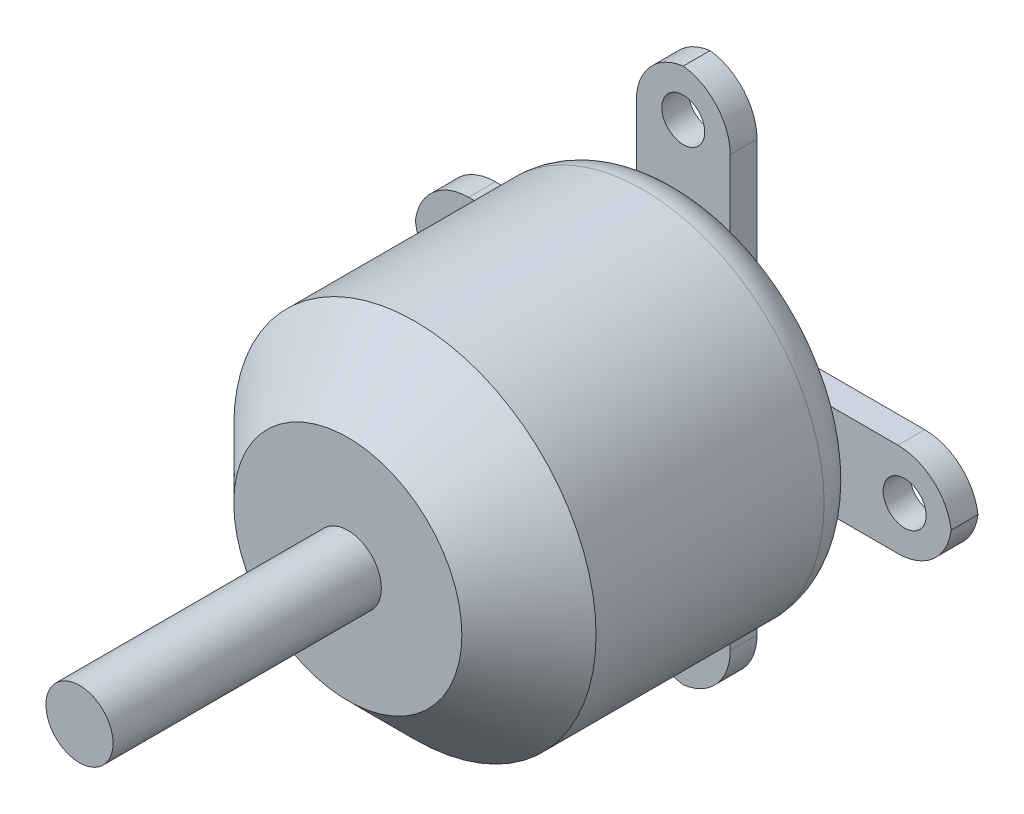
ISO-10303-21;
HEADER;
FILE_DESCRIPTION(('STEP AP214'),'2;1');
FILE_NAME('part.step','',(''),(''),'','','');
FILE_SCHEMA(('AUTOMOTIVE_DESIGN { 1 0 10303 214 1 1 1 1 }'));
ENDSEC;
DATA;
#1=APPLICATION_CONTEXT('core data for automotive mechanical design processes');
#2=APPLICATION_PROTOCOL_DEFINITION('international standard','automotive_design',2000,#1);
#3=PRODUCT_CONTEXT('',#1,'mechanical');
#4=PRODUCT('Part','Part','',(#3));
#5=PRODUCT_RELATED_PRODUCT_CATEGORY('part','',(#4));
#6=PRODUCT_DEFINITION_FORMATION('','',#4);
#7=PRODUCT_DEFINITION_CONTEXT('part definition',#1,'design');
#8=PRODUCT_DEFINITION('design','',#6,#7);
#9=PRODUCT_DEFINITION_SHAPE('','',#8);
#10=(LENGTH_UNIT() NAMED_UNIT(*) SI_UNIT(.MILLI.,.METRE.));
#11=(NAMED_UNIT(*) PLANE_ANGLE_UNIT() SI_UNIT($,.RADIAN.));
#12=(NAMED_UNIT(*) SI_UNIT($,.STERADIAN.) SOLID_ANGLE_UNIT());
#13=UNCERTAINTY_MEASURE_WITH_UNIT(LENGTH_MEASURE(1.E-05),#10,'distance_accuracy_value','');
#14=(GEOMETRIC_REPRESENTATION_CONTEXT(3) GLOBAL_UNCERTAINTY_ASSIGNED_CONTEXT((#13)) GLOBAL_UNIT_ASSIGNED_CONTEXT((#10,
#11,#12)) REPRESENTATION_CONTEXT('',''));
#15=CARTESIAN_POINT('',(0.,0.,0.));
#16=DIRECTION('',(0.,0.,1.));
#17=DIRECTION('',(1.,0.,0.));
#18=AXIS2_PLACEMENT_3D('',#15,#16,#17);
#19=CARTESIAN_POINT('',(0.,0.,0.));
#20=DIRECTION('',(0.,0.,1.));
#21=DIRECTION('',(1.,0.,0.));
#22=AXIS2_PLACEMENT_3D('',#19,#20,#21);
#23=PLANE('',#22);
#24=DIRECTION('',(0.,-1.,0.));
#25=VECTOR('',#24,1.);
#26=CARTESIAN_POINT('',(3.5,16.,0.));
#27=LINE('',#26,#25);
#28=CARTESIAN_POINT('',(3.5,9.89949493661167,0.));
#29=VERTEX_POINT('',#28);
#30=CARTESIAN_POINT('',(3.5,7.5,0.));
#31=VERTEX_POINT('',#30);
#32=EDGE_CURVE('E306',#29,#31,#27,.T.);
#33=ORIENTED_EDGE('',*,*,#32,.F.);
#34=CARTESIAN_POINT('',(0.,0.,0.));
#35=DIRECTION('',(0.,0.,1.));
#36=DIRECTION('',(1.,0.,0.));
#37=AXIS2_PLACEMENT_3D('',#34,#35,#36);
#38=CIRCLE('',#37,10.5);
#39=CARTESIAN_POINT('',(9.89949493661166,3.5,0.));
#40=VERTEX_POINT('',#39);
#41=EDGE_CURVE('E635',#29,#40,#38,.F.);
#42=ORIENTED_EDGE('',*,*,#41,.T.);
#43=DIRECTION('',(1.,0.,0.));
#44=VECTOR('',#43,1.);
#45=CARTESIAN_POINT('',(16.,3.5,0.));
#46=LINE('',#45,#44);
#47=CARTESIAN_POINT('',(7.5,3.5,0.));
#48=VERTEX_POINT('',#47);
#49=EDGE_CURVE('E55',#48,#40,#46,.T.);
#50=ORIENTED_EDGE('',*,*,#49,.F.);
#51=CARTESIAN_POINT('',(7.5,7.5,0.));
#52=DIRECTION('',(0.,0.,1.));
#53=DIRECTION('',(1.,0.,0.));
#54=AXIS2_PLACEMENT_3D('',#51,#52,#53);
#55=CIRCLE('',#54,4.);
#56=EDGE_CURVE('E50',#31,#48,#55,.T.);
#57=ORIENTED_EDGE('',*,*,#56,.F.);
#58=EDGE_LOOP('',(#33,#42,#50,#57));
#59=FACE_BOUND('',#58,.T.);
#60=ADVANCED_FACE('F34',(#59),#23,.F.);
#61=DIRECTION('',(-1.,0.,0.));
#62=VECTOR('',#61,1.);
#63=CARTESIAN_POINT('',(16.,-3.5,0.));
#64=LINE('',#63,#62);
#65=CARTESIAN_POINT('',(9.89949493661044,-3.5,0.));
#66=VERTEX_POINT('',#65);
#67=CARTESIAN_POINT('',(7.5,-3.5,0.));
#68=VERTEX_POINT('',#67);
#69=EDGE_CURVE('E320',#66,#68,#64,.T.);
#70=ORIENTED_EDGE('',*,*,#69,.F.);
#71=CARTESIAN_POINT('',(3.5,-9.89949493661166,0.));
#72=VERTEX_POINT('',#71);
#73=EDGE_CURVE('E241',#66,#72,#38,.F.);
#74=ORIENTED_EDGE('',*,*,#73,.T.);
#75=DIRECTION('',(0.,-1.,0.));
#76=VECTOR('',#75,1.);
#77=CARTESIAN_POINT('',(3.5,-7.5,0.));
#78=LINE('',#77,#76);
#79=CARTESIAN_POINT('',(3.5,-7.5,0.));
#80=VERTEX_POINT('',#79);
#81=EDGE_CURVE('E329',#80,#72,#78,.T.);
#82=ORIENTED_EDGE('',*,*,#81,.F.);
#83=CARTESIAN_POINT('',(7.5,-7.5,0.));
#84=DIRECTION('',(0.,0.,1.));
#85=DIRECTION('',(-1.,0.,0.));
#86=AXIS2_PLACEMENT_3D('',#83,#84,#85);
#87=CIRCLE('',#86,4.);
#88=EDGE_CURVE('E324',#68,#80,#87,.T.);
#89=ORIENTED_EDGE('',*,*,#88,.F.);
#90=EDGE_LOOP('',(#70,#74,#82,#89));
#91=FACE_BOUND('',#90,.T.);
#92=ADVANCED_FACE('F270',(#91),#23,.F.);
#93=DIRECTION('',(0.,1.,0.));
#94=VECTOR('',#93,1.);
#95=CARTESIAN_POINT('',(-3.5,-7.5,0.));
#96=LINE('',#95,#94);
#97=CARTESIAN_POINT('',(-3.5,-9.89949493661166,0.));
#98=VERTEX_POINT('',#97);
#99=CARTESIAN_POINT('',(-3.5,-7.5,0.));
#100=VERTEX_POINT('',#99);
#101=EDGE_CURVE('E338',#98,#100,#96,.T.);
#102=ORIENTED_EDGE('',*,*,#101,.F.);
#103=CARTESIAN_POINT('',(-9.89949493661167,-3.5,0.));
#104=VERTEX_POINT('',#103);
#105=EDGE_CURVE('E638',#98,#104,#38,.F.);
#106=ORIENTED_EDGE('',*,*,#105,.T.);
#107=DIRECTION('',(-1.,0.,0.));
#108=VECTOR('',#107,1.);
#109=CARTESIAN_POINT('',(-7.5,-3.5,0.));
#110=LINE('',#109,#108);
#111=CARTESIAN_POINT('',(-7.5,-3.5,0.));
#112=VERTEX_POINT('',#111);
#113=EDGE_CURVE('E347',#112,#104,#110,.T.);
#114=ORIENTED_EDGE('',*,*,#113,.F.);
#115=CARTESIAN_POINT('',(-7.5,-7.5,0.));
#116=DIRECTION('',(0.,0.,1.));
#117=DIRECTION('',(1.,0.,0.));
#118=AXIS2_PLACEMENT_3D('',#115,#116,#117);
#119=CIRCLE('',#118,4.);
#120=EDGE_CURVE('E343',#100,#112,#119,.T.);
#121=ORIENTED_EDGE('',*,*,#120,.F.);
#122=EDGE_LOOP('',(#102,#106,#114,#121));
#123=FACE_BOUND('',#122,.T.);
#124=ADVANCED_FACE('F276',(#123),#23,.F.);
#125=DIRECTION('',(0.,1.,0.));
#126=VECTOR('',#125,1.);
#127=CARTESIAN_POINT('',(-3.5,16.,0.));
#128=LINE('',#127,#126);
#129=CARTESIAN_POINT('',(-3.5,7.5,0.));
#130=VERTEX_POINT('',#129);
#131=CARTESIAN_POINT('',(-3.5,9.89949493661167,0.));
#132=VERTEX_POINT('',#131);
#133=EDGE_CURVE('E290',#130,#132,#128,.T.);
#134=ORIENTED_EDGE('',*,*,#133,.F.);
#135=CARTESIAN_POINT('',(-7.5,7.5,0.));
#136=DIRECTION('',(0.,0.,1.));
#137=DIRECTION('',(-1.,0.,0.));
#138=AXIS2_PLACEMENT_3D('',#135,#136,#137);
#139=CIRCLE('',#138,4.);
#140=CARTESIAN_POINT('',(-7.5,3.5,0.));
#141=VERTEX_POINT('',#140);
#142=EDGE_CURVE('E222',#141,#130,#139,.T.);
#143=ORIENTED_EDGE('',*,*,#142,.F.);
#144=DIRECTION('',(1.,0.,0.));
#145=VECTOR('',#144,1.);
#146=CARTESIAN_POINT('',(-7.5,3.5,0.));
#147=LINE('',#146,#145);
#148=CARTESIAN_POINT('',(-9.89949493661167,3.5,0.));
#149=VERTEX_POINT('',#148);
#150=EDGE_CURVE('E355',#149,#141,#147,.T.);
#151=ORIENTED_EDGE('',*,*,#150,.F.);
#152=EDGE_CURVE('E293',#149,#132,#38,.F.);
#153=ORIENTED_EDGE('',*,*,#152,.T.);
#154=EDGE_LOOP('',(#134,#143,#151,#153));
#155=FACE_BOUND('',#154,.T.);
#156=ADVANCED_FACE('F272',(#155),#23,.F.);
#157=CARTESIAN_POINT('',(0.,0.,25.));
#158=DIRECTION('',(0.,0.,-1.));
#159=DIRECTION('',(-1.,0.,0.));
#160=AXIS2_PLACEMENT_3D('',#157,#158,#159);
#161=CYLINDRICAL_SURFACE('',#160,13.5);
#162=CARTESIAN_POINT('',(0.,0.,20.));
#163=DIRECTION('',(0.,0.,1.));
#164=DIRECTION('',(1.,0.,0.));
#165=AXIS2_PLACEMENT_3D('',#162,#163,#164);
#166=CIRCLE('',#165,13.5);
#167=CARTESIAN_POINT('',(13.5,0.,20.));
#168=VERTEX_POINT('',#167);
#169=EDGE_CURVE('E11',#168,#168,#166,.F.);
#170=ORIENTED_EDGE('',*,*,#169,.T.);
#171=EDGE_LOOP('',(#170));
#172=FACE_BOUND('',#171,.T.);
#173=CARTESIAN_POINT('',(0.,0.,3.));
#174=DIRECTION('',(0.,0.,1.));
#175=DIRECTION('',(1.,0.,0.));
#176=AXIS2_PLACEMENT_3D('',#173,#174,#175);
#177=CIRCLE('',#176,13.5);
#178=CARTESIAN_POINT('',(13.5,0.,3.));
#179=VERTEX_POINT('',#178);
#180=EDGE_CURVE('E235',#179,#179,#177,.T.);
#181=ORIENTED_EDGE('',*,*,#180,.T.);
#182=EDGE_LOOP('',(#181));
#183=FACE_BOUND('',#182,.T.);
#184=ADVANCED_FACE('F281',(#172,#183),#161,.T.);
#185=CARTESIAN_POINT('',(0.,0.,25.));
#186=DIRECTION('',(0.,0.,1.));
#187=DIRECTION('',(1.,0.,0.));
#188=AXIS2_PLACEMENT_3D('',#185,#186,#187);
#189=PLANE('',#188);
#190=CARTESIAN_POINT('',(0.,0.,25.));
#191=DIRECTION('',(0.,0.,1.));
#192=DIRECTION('',(1.,0.,0.));
#193=AXIS2_PLACEMENT_3D('',#190,#191,#192);
#194=CIRCLE('',#193,8.49999999999999);
#195=CARTESIAN_POINT('',(8.49999999999999,0.,25.));
#196=VERTEX_POINT('',#195);
#197=EDGE_CURVE('E43',#196,#196,#194,.T.);
#198=ORIENTED_EDGE('',*,*,#197,.T.);
#199=EDGE_LOOP('',(#198));
#200=FACE_BOUND('',#199,.T.);
#201=CARTESIAN_POINT('',(0.,0.,25.));
#202=DIRECTION('',(0.,0.,1.));
#203=DIRECTION('',(1.,0.,0.));
#204=AXIS2_PLACEMENT_3D('',#201,#202,#203);
#205=CIRCLE('',#204,2.5);
#206=CARTESIAN_POINT('',(2.5,0.,25.));
#207=VERTEX_POINT('',#206);
#208=EDGE_CURVE('E223',#207,#207,#205,.T.);
#209=ORIENTED_EDGE('',*,*,#208,.F.);
#210=EDGE_LOOP('',(#209));
#211=FACE_BOUND('',#210,.T.);
#212=ADVANCED_FACE('F251',(#200,#211),#189,.T.);
#213=CARTESIAN_POINT('',(0.,0.,45.));
#214=DIRECTION('',(0.,0.,-1.));
#215=DIRECTION('',(-1.,0.,0.));
#216=AXIS2_PLACEMENT_3D('',#213,#214,#215);
#217=CYLINDRICAL_SURFACE('',#216,2.5);
#218=CARTESIAN_POINT('',(0.,0.,45.));
#219=DIRECTION('',(0.,0.,1.));
#220=DIRECTION('',(1.,0.,0.));
#221=AXIS2_PLACEMENT_3D('',#218,#219,#220);
#222=CIRCLE('',#221,2.5);
#223=CARTESIAN_POINT('',(2.5,0.,45.));
#224=VERTEX_POINT('',#223);
#225=EDGE_CURVE('E227',#224,#224,#222,.T.);
#226=ORIENTED_EDGE('',*,*,#225,.F.);
#227=EDGE_LOOP('',(#226));
#228=FACE_BOUND('',#227,.T.);
#229=ORIENTED_EDGE('',*,*,#208,.T.);
#230=EDGE_LOOP('',(#229));
#231=FACE_BOUND('',#230,.T.);
#232=ADVANCED_FACE('F549',(#228,#231),#217,.T.);
#233=CARTESIAN_POINT('',(0.,0.,45.));
#234=DIRECTION('',(0.,0.,1.));
#235=DIRECTION('',(1.,0.,0.));
#236=AXIS2_PLACEMENT_3D('',#233,#234,#235);
#237=PLANE('',#236);
#238=ORIENTED_EDGE('',*,*,#225,.T.);
#239=EDGE_LOOP('',(#238));
#240=FACE_BOUND('',#239,.T.);
#241=ADVANCED_FACE('F266',(#240),#237,.T.);
#242=CARTESIAN_POINT('',(0.,0.,3.));
#243=DIRECTION('',(0.,0.,1.));
#244=DIRECTION('',(1.,0.,0.));
#245=AXIS2_PLACEMENT_3D('',#242,#243,#244);
#246=TOROIDAL_SURFACE('',#245,10.5,3.);
#247=ORIENTED_EDGE('',*,*,#73,.F.);
#248=EDGE_CURVE('E240',#40,#66,#38,.F.);
#249=ORIENTED_EDGE('',*,*,#248,.F.);
#250=ORIENTED_EDGE('',*,*,#41,.F.);
#251=EDGE_CURVE('E426',#132,#29,#38,.F.);
#252=ORIENTED_EDGE('',*,*,#251,.F.);
#253=ORIENTED_EDGE('',*,*,#152,.F.);
#254=EDGE_CURVE('E636',#104,#149,#38,.F.);
#255=ORIENTED_EDGE('',*,*,#254,.F.);
#256=ORIENTED_EDGE('',*,*,#105,.F.);
#257=EDGE_CURVE('E243',#72,#98,#38,.F.);
#258=ORIENTED_EDGE('',*,*,#257,.F.);
#259=EDGE_LOOP('',(#247,#249,#250,#252,#253,#255,#256,#258));
#260=FACE_BOUND('',#259,.T.);
#261=ORIENTED_EDGE('',*,*,#180,.F.);
#262=EDGE_LOOP('',(#261));
#263=FACE_BOUND('',#262,.T.);
#264=ADVANCED_FACE('F256',(#260,#263),#246,.T.);
#265=CARTESIAN_POINT('',(0.,0.,25.));
#266=DIRECTION('',(0.,0.,-1.));
#267=DIRECTION('',(-1.,0.,0.));
#268=AXIS2_PLACEMENT_3D('',#265,#266,#267);
#269=CONICAL_SURFACE('',#268,8.49999999999999,0.785398163397446);
#270=ORIENTED_EDGE('',*,*,#169,.F.);
#271=EDGE_LOOP('',(#270));
#272=FACE_BOUND('',#271,.T.);
#273=ORIENTED_EDGE('',*,*,#197,.F.);
#274=EDGE_LOOP('',(#273));
#275=FACE_BOUND('',#274,.T.);
#276=ADVANCED_FACE('F36',(#272,#275),#269,.T.);
#277=CARTESIAN_POINT('',(-7.5,7.5,0.));
#278=DIRECTION('',(0.,0.,-1.));
#279=DIRECTION('',(-1.,0.,0.));
#280=AXIS2_PLACEMENT_3D('',#277,#278,#279);
#281=PLANE('',#280);
#282=CARTESIAN_POINT('',(1.72828326272735E-13,-16.5,0.));
#283=DIRECTION('',(0.,0.,-1.));
#284=DIRECTION('',(-1.,0.,0.));
#285=AXIS2_PLACEMENT_3D('',#282,#283,#284);
#286=CIRCLE('',#285,1.6);
#287=CARTESIAN_POINT('',(-1.59999999999983,-16.5,0.));
#288=VERTEX_POINT('',#287);
#289=EDGE_CURVE('E957',#288,#288,#286,.T.);
#290=ORIENTED_EDGE('',*,*,#289,.T.);
#291=EDGE_LOOP('',(#290));
#292=FACE_BOUND('',#291,.T.);
#293=CARTESIAN_POINT('',(3.5,-16.,0.));
#294=VERTEX_POINT('',#293);
#295=EDGE_CURVE('E328',#72,#294,#78,.T.);
#296=ORIENTED_EDGE('',*,*,#295,.F.);
#297=ORIENTED_EDGE('',*,*,#257,.T.);
#298=CARTESIAN_POINT('',(-3.5,-16.,0.));
#299=VERTEX_POINT('',#298);
#300=EDGE_CURVE('E339',#299,#98,#96,.T.);
#301=ORIENTED_EDGE('',*,*,#300,.F.);
#302=CARTESIAN_POINT('',(0.499999999999999,-16.,0.));
#303=DIRECTION('',(0.,0.,-1.));
#304=DIRECTION('',(-1.,0.,0.));
#305=AXIS2_PLACEMENT_3D('',#302,#303,#304);
#306=CIRCLE('',#305,4.);
#307=CARTESIAN_POINT('',(0.,-19.9686269665969,0.));
#308=VERTEX_POINT('',#307);
#309=EDGE_CURVE('E335',#308,#299,#306,.T.);
#310=ORIENTED_EDGE('',*,*,#309,.F.);
#311=CARTESIAN_POINT('',(-0.500000000000002,-16.,0.));
#312=DIRECTION('',(0.,0.,-1.));
#313=DIRECTION('',(-1.,0.,0.));
#314=AXIS2_PLACEMENT_3D('',#311,#312,#313);
#315=CIRCLE('',#314,4.);
#316=EDGE_CURVE('E332',#294,#308,#315,.T.);
#317=ORIENTED_EDGE('',*,*,#316,.F.);
#318=EDGE_LOOP('',(#296,#297,#301,#310,#317));
#319=FACE_BOUND('',#318,.T.);
#320=ADVANCED_FACE('F255',(#292,#319),#281,.F.);
#321=CARTESIAN_POINT('',(-16.5,-1.15218884181823E-13,0.));
#322=DIRECTION('',(0.,0.,-1.));
#323=DIRECTION('',(-1.,0.,0.));
#324=AXIS2_PLACEMENT_3D('',#321,#322,#323);
#325=CIRCLE('',#324,1.6);
#326=CARTESIAN_POINT('',(-18.1,-1.15218884181823E-13,0.));
#327=VERTEX_POINT('',#326);
#328=EDGE_CURVE('E951',#327,#327,#325,.T.);
#329=ORIENTED_EDGE('',*,*,#328,.T.);
#330=EDGE_LOOP('',(#329));
#331=FACE_BOUND('',#330,.T.);
#332=CARTESIAN_POINT('',(-16.,-3.5,0.));
#333=VERTEX_POINT('',#332);
#334=EDGE_CURVE('E346',#104,#333,#110,.T.);
#335=ORIENTED_EDGE('',*,*,#334,.F.);
#336=ORIENTED_EDGE('',*,*,#254,.T.);
#337=CARTESIAN_POINT('',(-16.,3.5,0.));
#338=VERTEX_POINT('',#337);
#339=EDGE_CURVE('E219',#338,#149,#147,.T.);
#340=ORIENTED_EDGE('',*,*,#339,.F.);
#341=CARTESIAN_POINT('',(-16.,-0.5,0.));
#342=DIRECTION('',(0.,0.,-1.));
#343=DIRECTION('',(1.,0.,0.));
#344=AXIS2_PLACEMENT_3D('',#341,#342,#343);
#345=CIRCLE('',#344,4.);
#346=CARTESIAN_POINT('',(-19.9686269665969,0.,0.));
#347=VERTEX_POINT('',#346);
#348=EDGE_CURVE('E353',#347,#338,#345,.T.);
#349=ORIENTED_EDGE('',*,*,#348,.F.);
#350=CARTESIAN_POINT('',(-16.,0.5,0.));
#351=DIRECTION('',(0.,0.,-1.));
#352=DIRECTION('',(-1.,0.,0.));
#353=AXIS2_PLACEMENT_3D('',#350,#351,#352);
#354=CIRCLE('',#353,4.);
#355=EDGE_CURVE('E350',#333,#347,#354,.T.);
#356=ORIENTED_EDGE('',*,*,#355,.F.);
#357=EDGE_LOOP('',(#335,#336,#340,#349,#356));
#358=FACE_BOUND('',#357,.T.);
#359=ADVANCED_FACE('F262',(#331,#358),#281,.F.);
#360=CARTESIAN_POINT('',(0.,16.5,0.));
#361=DIRECTION('',(0.,0.,-1.));
#362=DIRECTION('',(-1.,0.,0.));
#363=AXIS2_PLACEMENT_3D('',#360,#361,#362);
#364=CIRCLE('',#363,1.6);
#365=CARTESIAN_POINT('',(-1.60000000000006,16.5,0.));
#366=VERTEX_POINT('',#365);
#367=EDGE_CURVE('E502',#366,#366,#364,.T.);
#368=ORIENTED_EDGE('',*,*,#367,.T.);
#369=EDGE_LOOP('',(#368));
#370=FACE_BOUND('',#369,.T.);
#371=CARTESIAN_POINT('',(-3.5,16.,0.));
#372=VERTEX_POINT('',#371);
#373=EDGE_CURVE('E296',#132,#372,#128,.T.);
#374=ORIENTED_EDGE('',*,*,#373,.F.);
#375=ORIENTED_EDGE('',*,*,#251,.T.);
#376=CARTESIAN_POINT('',(3.5,16.,0.));
#377=VERTEX_POINT('',#376);
#378=EDGE_CURVE('E307',#377,#29,#27,.T.);
#379=ORIENTED_EDGE('',*,*,#378,.F.);
#380=CARTESIAN_POINT('',(-0.499999999999998,16.,0.));
#381=DIRECTION('',(0.,0.,-1.));
#382=DIRECTION('',(-1.,0.,0.));
#383=AXIS2_PLACEMENT_3D('',#380,#381,#382);
#384=CIRCLE('',#383,4.);
#385=CARTESIAN_POINT('',(0.,19.9686269665969,0.));
#386=VERTEX_POINT('',#385);
#387=EDGE_CURVE('E298',#386,#377,#384,.T.);
#388=ORIENTED_EDGE('',*,*,#387,.F.);
#389=CARTESIAN_POINT('',(0.500000000000002,16.,0.));
#390=DIRECTION('',(0.,0.,-1.));
#391=DIRECTION('',(1.,0.,0.));
#392=AXIS2_PLACEMENT_3D('',#389,#390,#391);
#393=CIRCLE('',#392,4.);
#394=EDGE_CURVE('E295',#372,#386,#393,.T.);
#395=ORIENTED_EDGE('',*,*,#394,.F.);
#396=EDGE_LOOP('',(#374,#375,#379,#388,#395));
#397=FACE_BOUND('',#396,.T.);
#398=ADVANCED_FACE('F424',(#370,#397),#281,.F.);
#399=CARTESIAN_POINT('',(-7.5,7.5,-2.));
#400=DIRECTION('',(0.,0.,-1.));
#401=DIRECTION('',(-1.,0.,0.));
#402=AXIS2_PLACEMENT_3D('',#399,#400,#401);
#403=PLANE('',#402);
#404=CARTESIAN_POINT('',(0.,0.,-2.));
#405=DIRECTION('',(0.,0.,-1.));
#406=DIRECTION('',(-1.,0.,0.));
#407=AXIS2_PLACEMENT_3D('',#404,#405,#406);
#408=CIRCLE('',#407,4.);
#409=CARTESIAN_POINT('',(-4.,0.,-2.));
#410=VERTEX_POINT('',#409);
#411=EDGE_CURVE('E965',#410,#410,#408,.T.);
#412=ORIENTED_EDGE('',*,*,#411,.F.);
#413=EDGE_LOOP('',(#412));
#414=FACE_BOUND('',#413,.T.);
#415=CARTESIAN_POINT('',(-16.5,-1.15218884181823E-13,-2.));
#416=DIRECTION('',(0.,0.,-1.));
#417=DIRECTION('',(-1.,0.,0.));
#418=AXIS2_PLACEMENT_3D('',#415,#416,#417);
#419=CIRCLE('',#418,1.6);
#420=CARTESIAN_POINT('',(-18.1,-1.15218884181823E-13,-2.));
#421=VERTEX_POINT('',#420);
#422=EDGE_CURVE('E480',#421,#421,#419,.T.);
#423=ORIENTED_EDGE('',*,*,#422,.F.);
#424=EDGE_LOOP('',(#423));
#425=FACE_BOUND('',#424,.T.);
#426=CARTESIAN_POINT('',(16.5,0.,-2.));
#427=DIRECTION('',(0.,0.,-1.));
#428=DIRECTION('',(-1.,0.,0.));
#429=AXIS2_PLACEMENT_3D('',#426,#427,#428);
#430=CIRCLE('',#429,1.6);
#431=CARTESIAN_POINT('',(14.9,0.,-2.));
#432=VERTEX_POINT('',#431);
#433=EDGE_CURVE('E930',#432,#432,#430,.T.);
#434=ORIENTED_EDGE('',*,*,#433,.F.);
#435=EDGE_LOOP('',(#434));
#436=FACE_BOUND('',#435,.T.);
#437=CARTESIAN_POINT('',(-7.5,7.5,-2.));
#438=DIRECTION('',(0.,0.,1.));
#439=DIRECTION('',(-1.,0.,0.));
#440=AXIS2_PLACEMENT_3D('',#437,#438,#439);
#441=CIRCLE('',#440,4.);
#442=CARTESIAN_POINT('',(-7.5,3.5,-2.));
#443=VERTEX_POINT('',#442);
#444=CARTESIAN_POINT('',(-3.5,7.5,-2.));
#445=VERTEX_POINT('',#444);
#446=EDGE_CURVE('E208',#443,#445,#441,.T.);
#447=ORIENTED_EDGE('',*,*,#446,.T.);
#448=DIRECTION('',(0.,1.,0.));
#449=VECTOR('',#448,1.);
#450=CARTESIAN_POINT('',(-3.5,16.,-2.));
#451=LINE('',#450,#449);
#452=CARTESIAN_POINT('',(-3.5,16.,-2.));
#453=VERTEX_POINT('',#452);
#454=EDGE_CURVE('E195',#445,#453,#451,.T.);
#455=ORIENTED_EDGE('',*,*,#454,.T.);
#456=CARTESIAN_POINT('',(0.500000000000002,16.,-2.));
#457=DIRECTION('',(0.,0.,-1.));
#458=DIRECTION('',(1.,0.,0.));
#459=AXIS2_PLACEMENT_3D('',#456,#457,#458);
#460=CIRCLE('',#459,4.);
#461=CARTESIAN_POINT('',(0.,19.9686269665969,-2.));
#462=VERTEX_POINT('',#461);
#463=EDGE_CURVE('E207',#453,#462,#460,.T.);
#464=ORIENTED_EDGE('',*,*,#463,.T.);
#465=CARTESIAN_POINT('',(-0.499999999999998,16.,-2.));
#466=DIRECTION('',(0.,0.,-1.));
#467=DIRECTION('',(-1.,0.,0.));
#468=AXIS2_PLACEMENT_3D('',#465,#466,#467);
#469=CIRCLE('',#468,4.);
#470=CARTESIAN_POINT('',(3.5,16.,-2.));
#471=VERTEX_POINT('',#470);
#472=EDGE_CURVE('E419',#462,#471,#469,.T.);
#473=ORIENTED_EDGE('',*,*,#472,.T.);
#474=DIRECTION('',(0.,-1.,0.));
#475=VECTOR('',#474,1.);
#476=CARTESIAN_POINT('',(3.5,16.,-2.));
#477=LINE('',#476,#475);
#478=CARTESIAN_POINT('',(3.5,7.5,-2.));
#479=VERTEX_POINT('',#478);
#480=EDGE_CURVE('E431',#471,#479,#477,.T.);
#481=ORIENTED_EDGE('',*,*,#480,.T.);
#482=CARTESIAN_POINT('',(7.5,7.5,-2.));
#483=DIRECTION('',(0.,0.,1.));
#484=DIRECTION('',(1.,0.,0.));
#485=AXIS2_PLACEMENT_3D('',#482,#483,#484);
#486=CIRCLE('',#485,4.);
#487=CARTESIAN_POINT('',(7.5,3.5,-2.));
#488=VERTEX_POINT('',#487);
#489=EDGE_CURVE('E434',#479,#488,#486,.T.);
#490=ORIENTED_EDGE('',*,*,#489,.T.);
#491=DIRECTION('',(1.,0.,0.));
#492=VECTOR('',#491,1.);
#493=CARTESIAN_POINT('',(16.,3.5,-2.));
#494=LINE('',#493,#492);
#495=CARTESIAN_POINT('',(16.,3.5,-2.));
#496=VERTEX_POINT('',#495);
#497=EDGE_CURVE('E438',#488,#496,#494,.T.);
#498=ORIENTED_EDGE('',*,*,#497,.T.);
#499=CARTESIAN_POINT('',(16.,-0.5,-2.));
#500=DIRECTION('',(0.,0.,-1.));
#501=DIRECTION('',(-1.,0.,0.));
#502=AXIS2_PLACEMENT_3D('',#499,#500,#501);
#503=CIRCLE('',#502,4.);
#504=CARTESIAN_POINT('',(19.9686269665969,0.,-2.));
#505=VERTEX_POINT('',#504);
#506=EDGE_CURVE('E445',#496,#505,#503,.T.);
#507=ORIENTED_EDGE('',*,*,#506,.T.);
#508=CARTESIAN_POINT('',(16.,0.5,-2.));
#509=DIRECTION('',(0.,0.,-1.));
#510=DIRECTION('',(-1.,0.,0.));
#511=AXIS2_PLACEMENT_3D('',#508,#509,#510);
#512=CIRCLE('',#511,4.);
#513=CARTESIAN_POINT('',(16.,-3.5,-2.));
#514=VERTEX_POINT('',#513);
#515=EDGE_CURVE('E448',#505,#514,#512,.T.);
#516=ORIENTED_EDGE('',*,*,#515,.T.);
#517=DIRECTION('',(-1.,0.,0.));
#518=VECTOR('',#517,1.);
#519=CARTESIAN_POINT('',(16.,-3.5,-2.));
#520=LINE('',#519,#518);
#521=CARTESIAN_POINT('',(7.5,-3.5,-2.));
#522=VERTEX_POINT('',#521);
#523=EDGE_CURVE('E451',#514,#522,#520,.T.);
#524=ORIENTED_EDGE('',*,*,#523,.T.);
#525=CARTESIAN_POINT('',(7.5,-7.5,-2.));
#526=DIRECTION('',(0.,0.,1.));
#527=DIRECTION('',(-1.,0.,0.));
#528=AXIS2_PLACEMENT_3D('',#525,#526,#527);
#529=CIRCLE('',#528,4.);
#530=CARTESIAN_POINT('',(3.5,-7.5,-2.));
#531=VERTEX_POINT('',#530);
#532=EDGE_CURVE('E453',#522,#531,#529,.T.);
#533=ORIENTED_EDGE('',*,*,#532,.T.);
#534=DIRECTION('',(0.,-1.,0.));
#535=VECTOR('',#534,1.);
#536=CARTESIAN_POINT('',(3.5,-7.5,-2.));
#537=LINE('',#536,#535);
#538=CARTESIAN_POINT('',(3.5,-16.,-2.));
#539=VERTEX_POINT('',#538);
#540=EDGE_CURVE('E456',#531,#539,#537,.T.);
#541=ORIENTED_EDGE('',*,*,#540,.T.);
#542=CARTESIAN_POINT('',(-0.500000000000002,-16.,-2.));
#543=DIRECTION('',(0.,0.,-1.));
#544=DIRECTION('',(-1.,0.,0.));
#545=AXIS2_PLACEMENT_3D('',#542,#543,#544);
#546=CIRCLE('',#545,4.);
#547=CARTESIAN_POINT('',(0.,-19.9686269665969,-2.));
#548=VERTEX_POINT('',#547);
#549=EDGE_CURVE('E459',#539,#548,#546,.T.);
#550=ORIENTED_EDGE('',*,*,#549,.T.);
#551=CARTESIAN_POINT('',(0.499999999999999,-16.,-2.));
#552=DIRECTION('',(0.,0.,-1.));
#553=DIRECTION('',(-1.,0.,0.));
#554=AXIS2_PLACEMENT_3D('',#551,#552,#553);
#555=CIRCLE('',#554,4.);
#556=CARTESIAN_POINT('',(-3.5,-16.,-2.));
#557=VERTEX_POINT('',#556);
#558=EDGE_CURVE('E462',#548,#557,#555,.T.);
#559=ORIENTED_EDGE('',*,*,#558,.T.);
#560=DIRECTION('',(0.,1.,0.));
#561=VECTOR('',#560,1.);
#562=CARTESIAN_POINT('',(-3.5,-7.5,-2.));
#563=LINE('',#562,#561);
#564=CARTESIAN_POINT('',(-3.5,-7.5,-2.));
#565=VERTEX_POINT('',#564);
#566=EDGE_CURVE('E465',#557,#565,#563,.T.);
#567=ORIENTED_EDGE('',*,*,#566,.T.);
#568=CARTESIAN_POINT('',(-7.5,-7.5,-2.));
#569=DIRECTION('',(0.,0.,1.));
#570=DIRECTION('',(1.,0.,0.));
#571=AXIS2_PLACEMENT_3D('',#568,#569,#570);
#572=CIRCLE('',#571,4.);
#573=CARTESIAN_POINT('',(-7.5,-3.5,-2.));
#574=VERTEX_POINT('',#573);
#575=EDGE_CURVE('E468',#565,#574,#572,.T.);
#576=ORIENTED_EDGE('',*,*,#575,.T.);
#577=DIRECTION('',(-1.,0.,0.));
#578=VECTOR('',#577,1.);
#579=CARTESIAN_POINT('',(-7.5,-3.5,-2.));
#580=LINE('',#579,#578);
#581=CARTESIAN_POINT('',(-16.,-3.5,-2.));
#582=VERTEX_POINT('',#581);
#583=EDGE_CURVE('E470',#574,#582,#580,.T.);
#584=ORIENTED_EDGE('',*,*,#583,.T.);
#585=CARTESIAN_POINT('',(-16.,0.5,-2.));
#586=DIRECTION('',(0.,0.,-1.));
#587=DIRECTION('',(-1.,0.,0.));
#588=AXIS2_PLACEMENT_3D('',#585,#586,#587);
#589=CIRCLE('',#588,4.);
#590=CARTESIAN_POINT('',(-19.9686269665969,0.,-2.));
#591=VERTEX_POINT('',#590);
#592=EDGE_CURVE('E473',#582,#591,#589,.T.);
#593=ORIENTED_EDGE('',*,*,#592,.T.);
#594=CARTESIAN_POINT('',(-16.,-0.5,-2.));
#595=DIRECTION('',(0.,0.,-1.));
#596=DIRECTION('',(1.,0.,0.));
#597=AXIS2_PLACEMENT_3D('',#594,#595,#596);
#598=CIRCLE('',#597,4.);
#599=CARTESIAN_POINT('',(-16.,3.5,-2.));
#600=VERTEX_POINT('',#599);
#601=EDGE_CURVE('E476',#591,#600,#598,.T.);
#602=ORIENTED_EDGE('',*,*,#601,.T.);
#603=DIRECTION('',(1.,0.,0.));
#604=VECTOR('',#603,1.);
#605=CARTESIAN_POINT('',(-7.5,3.5,-2.));
#606=LINE('',#605,#604);
#607=EDGE_CURVE('E214',#600,#443,#606,.T.);
#608=ORIENTED_EDGE('',*,*,#607,.T.);
#609=EDGE_LOOP('',(#447,#455,#464,#473,#481,#490,#498,#507,#516,#524,#533,#541,#550,#559,#567,
#576,#584,#593,#602,#608));
#610=FACE_BOUND('',#609,.T.);
#611=CARTESIAN_POINT('',(0.,16.5,-2.));
#612=DIRECTION('',(0.,0.,-1.));
#613=DIRECTION('',(-1.,0.,0.));
#614=AXIS2_PLACEMENT_3D('',#611,#612,#613);
#615=CIRCLE('',#614,1.6);
#616=CARTESIAN_POINT('',(-1.60000000000006,16.5,-2.));
#617=VERTEX_POINT('',#616);
#618=EDGE_CURVE('E506',#617,#617,#615,.T.);
#619=ORIENTED_EDGE('',*,*,#618,.F.);
#620=EDGE_LOOP('',(#619));
#621=FACE_BOUND('',#620,.T.);
#622=CARTESIAN_POINT('',(1.72828326272735E-13,-16.5,-2.));
#623=DIRECTION('',(0.,0.,-1.));
#624=DIRECTION('',(-1.,0.,0.));
#625=AXIS2_PLACEMENT_3D('',#622,#623,#624);
#626=CIRCLE('',#625,1.6);
#627=CARTESIAN_POINT('',(-1.59999999999983,-16.5,-2.));
#628=VERTEX_POINT('',#627);
#629=EDGE_CURVE('E954',#628,#628,#626,.T.);
#630=ORIENTED_EDGE('',*,*,#629,.F.);
#631=EDGE_LOOP('',(#630));
#632=FACE_BOUND('',#631,.T.);
#633=ADVANCED_FACE('F211',(#414,#425,#436,#610,#621,#632),#403,.T.);
#634=CARTESIAN_POINT('',(16.,3.5,0.));
#635=VERTEX_POINT('',#634);
#636=EDGE_CURVE('E313',#40,#635,#46,.T.);
#637=ORIENTED_EDGE('',*,*,#636,.F.);
#638=ORIENTED_EDGE('',*,*,#248,.T.);
#639=CARTESIAN_POINT('',(16.,-3.5,0.));
#640=VERTEX_POINT('',#639);
#641=EDGE_CURVE('E321',#640,#66,#64,.T.);
#642=ORIENTED_EDGE('',*,*,#641,.F.);
#643=CARTESIAN_POINT('',(16.,0.5,0.));
#644=DIRECTION('',(0.,0.,-1.));
#645=DIRECTION('',(-1.,0.,0.));
#646=AXIS2_PLACEMENT_3D('',#643,#644,#645);
#647=CIRCLE('',#646,4.);
#648=CARTESIAN_POINT('',(19.9686269665969,0.,0.));
#649=VERTEX_POINT('',#648);
#650=EDGE_CURVE('E318',#649,#640,#647,.T.);
#651=ORIENTED_EDGE('',*,*,#650,.F.);
#652=CARTESIAN_POINT('',(16.,-0.5,0.));
#653=DIRECTION('',(0.,0.,-1.));
#654=DIRECTION('',(-1.,0.,0.));
#655=AXIS2_PLACEMENT_3D('',#652,#653,#654);
#656=CIRCLE('',#655,4.);
#657=EDGE_CURVE('E315',#635,#649,#656,.T.);
#658=ORIENTED_EDGE('',*,*,#657,.F.);
#659=EDGE_LOOP('',(#637,#638,#642,#651,#658));
#660=FACE_BOUND('',#659,.T.);
#661=CARTESIAN_POINT('',(16.5,0.,0.));
#662=DIRECTION('',(0.,0.,-1.));
#663=DIRECTION('',(-1.,0.,0.));
#664=AXIS2_PLACEMENT_3D('',#661,#662,#663);
#665=CIRCLE('',#664,1.6);
#666=CARTESIAN_POINT('',(14.9,0.,0.));
#667=VERTEX_POINT('',#666);
#668=EDGE_CURVE('E939',#667,#667,#665,.T.);
#669=ORIENTED_EDGE('',*,*,#668,.T.);
#670=EDGE_LOOP('',(#669));
#671=FACE_BOUND('',#670,.T.);
#672=ADVANCED_FACE('F265',(#660,#671),#281,.F.);
#673=CARTESIAN_POINT('',(-7.5,7.5,-2.));
#674=DIRECTION('',(0.,0.,1.));
#675=DIRECTION('',(1.,0.,0.));
#676=AXIS2_PLACEMENT_3D('',#673,#674,#675);
#677=CYLINDRICAL_SURFACE('',#676,4.);
#678=ORIENTED_EDGE('',*,*,#142,.T.);
#679=DIRECTION('',(0.,0.,1.));
#680=VECTOR('',#679,1.);
#681=CARTESIAN_POINT('',(-3.5,7.5,-2.));
#682=LINE('',#681,#680);
#683=EDGE_CURVE('E200',#445,#130,#682,.T.);
#684=ORIENTED_EDGE('',*,*,#683,.F.);
#685=ORIENTED_EDGE('',*,*,#446,.F.);
#686=DIRECTION('',(0.,0.,1.));
#687=VECTOR('',#686,1.);
#688=CARTESIAN_POINT('',(-7.5,3.5,-2.));
#689=LINE('',#688,#687);
#690=EDGE_CURVE('E358',#443,#141,#689,.T.);
#691=ORIENTED_EDGE('',*,*,#690,.T.);
#692=EDGE_LOOP('',(#678,#684,#685,#691));
#693=FACE_BOUND('',#692,.T.);
#694=ADVANCED_FACE('F221',(#693),#677,.F.);
#695=CARTESIAN_POINT('',(-3.5,16.,-2.));
#696=DIRECTION('',(1.,0.,0.));
#697=DIRECTION('',(0.,0.,-1.));
#698=AXIS2_PLACEMENT_3D('',#695,#696,#697);
#699=PLANE('',#698);
#700=ORIENTED_EDGE('',*,*,#133,.T.);
#701=ORIENTED_EDGE('',*,*,#373,.T.);
#702=DIRECTION('',(0.,0.,1.));
#703=VECTOR('',#702,1.);
#704=CARTESIAN_POINT('',(-3.5,16.,-2.));
#705=LINE('',#704,#703);
#706=EDGE_CURVE('E203',#453,#372,#705,.T.);
#707=ORIENTED_EDGE('',*,*,#706,.F.);
#708=ORIENTED_EDGE('',*,*,#454,.F.);
#709=ORIENTED_EDGE('',*,*,#683,.T.);
#710=EDGE_LOOP('',(#700,#701,#707,#708,#709));
#711=FACE_BOUND('',#710,.T.);
#712=ADVANCED_FACE('F198',(#711),#699,.F.);
#713=CARTESIAN_POINT('',(0.500000000000002,16.,-2.));
#714=DIRECTION('',(0.,0.,1.));
#715=DIRECTION('',(1.,0.,0.));
#716=AXIS2_PLACEMENT_3D('',#713,#714,#715);
#717=CYLINDRICAL_SURFACE('',#716,4.);
#718=ORIENTED_EDGE('',*,*,#394,.T.);
#719=DIRECTION('',(0.,0.,1.));
#720=VECTOR('',#719,1.);
#721=CARTESIAN_POINT('',(0.,19.9686269665969,-2.));
#722=LINE('',#721,#720);
#723=EDGE_CURVE('E229',#462,#386,#722,.T.);
#724=ORIENTED_EDGE('',*,*,#723,.F.);
#725=ORIENTED_EDGE('',*,*,#463,.F.);
#726=ORIENTED_EDGE('',*,*,#706,.T.);
#727=EDGE_LOOP('',(#718,#724,#725,#726));
#728=FACE_BOUND('',#727,.T.);
#729=ADVANCED_FACE('F686',(#728),#717,.T.);
#730=CARTESIAN_POINT('',(-0.499999999999998,16.,-2.));
#731=DIRECTION('',(0.,0.,1.));
#732=DIRECTION('',(1.,0.,0.));
#733=AXIS2_PLACEMENT_3D('',#730,#731,#732);
#734=CYLINDRICAL_SURFACE('',#733,4.);
#735=ORIENTED_EDGE('',*,*,#387,.T.);
#736=DIRECTION('',(0.,0.,1.));
#737=VECTOR('',#736,1.);
#738=CARTESIAN_POINT('',(3.5,16.,-2.));
#739=LINE('',#738,#737);
#740=EDGE_CURVE('E409',#471,#377,#739,.T.);
#741=ORIENTED_EDGE('',*,*,#740,.F.);
#742=ORIENTED_EDGE('',*,*,#472,.F.);
#743=ORIENTED_EDGE('',*,*,#723,.T.);
#744=EDGE_LOOP('',(#735,#741,#742,#743));
#745=FACE_BOUND('',#744,.T.);
#746=ADVANCED_FACE('F417',(#745),#734,.T.);
#747=CARTESIAN_POINT('',(3.5,16.,-2.));
#748=DIRECTION('',(-1.,0.,0.));
#749=DIRECTION('',(0.,-1.,0.));
#750=AXIS2_PLACEMENT_3D('',#747,#748,#749);
#751=PLANE('',#750);
#752=ORIENTED_EDGE('',*,*,#378,.T.);
#753=ORIENTED_EDGE('',*,*,#32,.T.);
#754=DIRECTION('',(0.,0.,1.));
#755=VECTOR('',#754,1.);
#756=CARTESIAN_POINT('',(3.5,7.5,-2.));
#757=LINE('',#756,#755);
#758=EDGE_CURVE('E406',#479,#31,#757,.T.);
#759=ORIENTED_EDGE('',*,*,#758,.F.);
#760=ORIENTED_EDGE('',*,*,#480,.F.);
#761=ORIENTED_EDGE('',*,*,#740,.T.);
#762=EDGE_LOOP('',(#752,#753,#759,#760,#761));
#763=FACE_BOUND('',#762,.T.);
#764=ADVANCED_FACE('F428',(#763),#751,.F.);
#765=CARTESIAN_POINT('',(7.5,7.5,-2.));
#766=DIRECTION('',(0.,0.,1.));
#767=DIRECTION('',(1.,0.,0.));
#768=AXIS2_PLACEMENT_3D('',#765,#766,#767);
#769=CYLINDRICAL_SURFACE('',#768,4.);
#770=ORIENTED_EDGE('',*,*,#56,.T.);
#771=DIRECTION('',(0.,0.,1.));
#772=VECTOR('',#771,1.);
#773=CARTESIAN_POINT('',(7.5,3.5,-2.));
#774=LINE('',#773,#772);
#775=EDGE_CURVE('E402',#488,#48,#774,.T.);
#776=ORIENTED_EDGE('',*,*,#775,.F.);
#777=ORIENTED_EDGE('',*,*,#489,.F.);
#778=ORIENTED_EDGE('',*,*,#758,.T.);
#779=EDGE_LOOP('',(#770,#776,#777,#778));
#780=FACE_BOUND('',#779,.T.);
#781=ADVANCED_FACE('F677',(#780),#769,.F.);
#782=CARTESIAN_POINT('',(16.,3.5,-2.));
#783=DIRECTION('',(0.,-1.,0.));
#784=DIRECTION('',(1.,0.,0.));
#785=AXIS2_PLACEMENT_3D('',#782,#783,#784);
#786=PLANE('',#785);
#787=ORIENTED_EDGE('',*,*,#49,.T.);
#788=ORIENTED_EDGE('',*,*,#636,.T.);
#789=DIRECTION('',(0.,0.,1.));
#790=VECTOR('',#789,1.);
#791=CARTESIAN_POINT('',(16.,3.5,-2.));
#792=LINE('',#791,#790);
#793=EDGE_CURVE('E398',#496,#635,#792,.T.);
#794=ORIENTED_EDGE('',*,*,#793,.F.);
#795=ORIENTED_EDGE('',*,*,#497,.F.);
#796=ORIENTED_EDGE('',*,*,#775,.T.);
#797=EDGE_LOOP('',(#787,#788,#794,#795,#796));
#798=FACE_BOUND('',#797,.T.);
#799=ADVANCED_FACE('F673',(#798),#786,.F.);
#800=CARTESIAN_POINT('',(16.,-0.5,-2.));
#801=DIRECTION('',(0.,0.,1.));
#802=DIRECTION('',(1.,0.,0.));
#803=AXIS2_PLACEMENT_3D('',#800,#801,#802);
#804=CYLINDRICAL_SURFACE('',#803,4.);
#805=ORIENTED_EDGE('',*,*,#657,.T.);
#806=DIRECTION('',(0.,0.,1.));
#807=VECTOR('',#806,1.);
#808=CARTESIAN_POINT('',(19.9686269665969,0.,-2.));
#809=LINE('',#808,#807);
#810=EDGE_CURVE('E394',#505,#649,#809,.T.);
#811=ORIENTED_EDGE('',*,*,#810,.F.);
#812=ORIENTED_EDGE('',*,*,#506,.F.);
#813=ORIENTED_EDGE('',*,*,#793,.T.);
#814=EDGE_LOOP('',(#805,#811,#812,#813));
#815=FACE_BOUND('',#814,.T.);
#816=ADVANCED_FACE('F539',(#815),#804,.T.);
#817=CARTESIAN_POINT('',(16.,0.5,-2.));
#818=DIRECTION('',(0.,0.,1.));
#819=DIRECTION('',(1.,0.,0.));
#820=AXIS2_PLACEMENT_3D('',#817,#818,#819);
#821=CYLINDRICAL_SURFACE('',#820,4.);
#822=ORIENTED_EDGE('',*,*,#650,.T.);
#823=DIRECTION('',(0.,0.,1.));
#824=VECTOR('',#823,1.);
#825=CARTESIAN_POINT('',(16.,-3.5,-2.));
#826=LINE('',#825,#824);
#827=EDGE_CURVE('E391',#514,#640,#826,.T.);
#828=ORIENTED_EDGE('',*,*,#827,.F.);
#829=ORIENTED_EDGE('',*,*,#515,.F.);
#830=ORIENTED_EDGE('',*,*,#810,.T.);
#831=EDGE_LOOP('',(#822,#828,#829,#830));
#832=FACE_BOUND('',#831,.T.);
#833=ADVANCED_FACE('F533',(#832),#821,.T.);
#834=CARTESIAN_POINT('',(16.,-3.5,-2.));
#835=DIRECTION('',(0.,1.,0.));
#836=DIRECTION('',(-1.,0.,0.));
#837=AXIS2_PLACEMENT_3D('',#834,#835,#836);
#838=PLANE('',#837);
#839=ORIENTED_EDGE('',*,*,#641,.T.);
#840=ORIENTED_EDGE('',*,*,#69,.T.);
#841=DIRECTION('',(0.,0.,1.));
#842=VECTOR('',#841,1.);
#843=CARTESIAN_POINT('',(7.5,-3.5,-2.));
#844=LINE('',#843,#842);
#845=EDGE_CURVE('E388',#522,#68,#844,.T.);
#846=ORIENTED_EDGE('',*,*,#845,.F.);
#847=ORIENTED_EDGE('',*,*,#523,.F.);
#848=ORIENTED_EDGE('',*,*,#827,.T.);
#849=EDGE_LOOP('',(#839,#840,#846,#847,#848));
#850=FACE_BOUND('',#849,.T.);
#851=ADVANCED_FACE('F538',(#850),#838,.F.);
#852=CARTESIAN_POINT('',(7.5,-7.5,-2.));
#853=DIRECTION('',(0.,0.,1.));
#854=DIRECTION('',(1.,0.,0.));
#855=AXIS2_PLACEMENT_3D('',#852,#853,#854);
#856=CYLINDRICAL_SURFACE('',#855,4.);
#857=ORIENTED_EDGE('',*,*,#88,.T.);
#858=DIRECTION('',(0.,0.,1.));
#859=VECTOR('',#858,1.);
#860=CARTESIAN_POINT('',(3.5,-7.5,-2.));
#861=LINE('',#860,#859);
#862=EDGE_CURVE('E385',#531,#80,#861,.T.);
#863=ORIENTED_EDGE('',*,*,#862,.F.);
#864=ORIENTED_EDGE('',*,*,#532,.F.);
#865=ORIENTED_EDGE('',*,*,#845,.T.);
#866=EDGE_LOOP('',(#857,#863,#864,#865));
#867=FACE_BOUND('',#866,.T.);
#868=ADVANCED_FACE('F574',(#867),#856,.F.);
#869=CARTESIAN_POINT('',(3.5,-7.5,-2.));
#870=DIRECTION('',(-1.,0.,0.));
#871=DIRECTION('',(0.,-1.,0.));
#872=AXIS2_PLACEMENT_3D('',#869,#870,#871);
#873=PLANE('',#872);
#874=ORIENTED_EDGE('',*,*,#81,.T.);
#875=ORIENTED_EDGE('',*,*,#295,.T.);
#876=DIRECTION('',(0.,0.,1.));
#877=VECTOR('',#876,1.);
#878=CARTESIAN_POINT('',(3.5,-16.,-2.));
#879=LINE('',#878,#877);
#880=EDGE_CURVE('E382',#539,#294,#879,.T.);
#881=ORIENTED_EDGE('',*,*,#880,.F.);
#882=ORIENTED_EDGE('',*,*,#540,.F.);
#883=ORIENTED_EDGE('',*,*,#862,.T.);
#884=EDGE_LOOP('',(#874,#875,#881,#882,#883));
#885=FACE_BOUND('',#884,.T.);
#886=ADVANCED_FACE('F578',(#885),#873,.F.);
#887=CARTESIAN_POINT('',(-0.500000000000002,-16.,-2.));
#888=DIRECTION('',(0.,0.,1.));
#889=DIRECTION('',(1.,0.,0.));
#890=AXIS2_PLACEMENT_3D('',#887,#888,#889);
#891=CYLINDRICAL_SURFACE('',#890,4.);
#892=ORIENTED_EDGE('',*,*,#316,.T.);
#893=DIRECTION('',(0.,0.,1.));
#894=VECTOR('',#893,1.);
#895=CARTESIAN_POINT('',(0.,-19.9686269665969,-2.));
#896=LINE('',#895,#894);
#897=EDGE_CURVE('E379',#548,#308,#896,.T.);
#898=ORIENTED_EDGE('',*,*,#897,.F.);
#899=ORIENTED_EDGE('',*,*,#549,.F.);
#900=ORIENTED_EDGE('',*,*,#880,.T.);
#901=EDGE_LOOP('',(#892,#898,#899,#900));
#902=FACE_BOUND('',#901,.T.);
#903=ADVANCED_FACE('F604',(#902),#891,.T.);
#904=CARTESIAN_POINT('',(0.499999999999999,-16.,-2.));
#905=DIRECTION('',(0.,0.,1.));
#906=DIRECTION('',(1.,0.,0.));
#907=AXIS2_PLACEMENT_3D('',#904,#905,#906);
#908=CYLINDRICAL_SURFACE('',#907,4.);
#909=ORIENTED_EDGE('',*,*,#309,.T.);
#910=DIRECTION('',(0.,0.,1.));
#911=VECTOR('',#910,1.);
#912=CARTESIAN_POINT('',(-3.5,-16.,-2.));
#913=LINE('',#912,#911);
#914=EDGE_CURVE('E375',#557,#299,#913,.T.);
#915=ORIENTED_EDGE('',*,*,#914,.F.);
#916=ORIENTED_EDGE('',*,*,#558,.F.);
#917=ORIENTED_EDGE('',*,*,#897,.T.);
#918=EDGE_LOOP('',(#909,#915,#916,#917));
#919=FACE_BOUND('',#918,.T.);
#920=ADVANCED_FACE('F610',(#919),#908,.T.);
#921=CARTESIAN_POINT('',(-3.5,-7.5,-2.));
#922=DIRECTION('',(1.,0.,0.));
#923=DIRECTION('',(0.,1.,0.));
#924=AXIS2_PLACEMENT_3D('',#921,#922,#923);
#925=PLANE('',#924);
#926=ORIENTED_EDGE('',*,*,#300,.T.);
#927=ORIENTED_EDGE('',*,*,#101,.T.);
#928=DIRECTION('',(0.,0.,1.));
#929=VECTOR('',#928,1.);
#930=CARTESIAN_POINT('',(-3.5,-7.5,-2.));
#931=LINE('',#930,#929);
#932=EDGE_CURVE('E372',#565,#100,#931,.T.);
#933=ORIENTED_EDGE('',*,*,#932,.F.);
#934=ORIENTED_EDGE('',*,*,#566,.F.);
#935=ORIENTED_EDGE('',*,*,#914,.T.);
#936=EDGE_LOOP('',(#926,#927,#933,#934,#935));
#937=FACE_BOUND('',#936,.T.);
#938=ADVANCED_FACE('F614',(#937),#925,.F.);
#939=CARTESIAN_POINT('',(-7.5,-7.5,-2.));
#940=DIRECTION('',(0.,0.,1.));
#941=DIRECTION('',(1.,0.,0.));
#942=AXIS2_PLACEMENT_3D('',#939,#940,#941);
#943=CYLINDRICAL_SURFACE('',#942,4.);
#944=ORIENTED_EDGE('',*,*,#120,.T.);
#945=DIRECTION('',(0.,0.,1.));
#946=VECTOR('',#945,1.);
#947=CARTESIAN_POINT('',(-7.5,-3.5,-2.));
#948=LINE('',#947,#946);
#949=EDGE_CURVE('E369',#574,#112,#948,.T.);
#950=ORIENTED_EDGE('',*,*,#949,.F.);
#951=ORIENTED_EDGE('',*,*,#575,.F.);
#952=ORIENTED_EDGE('',*,*,#932,.T.);
#953=EDGE_LOOP('',(#944,#950,#951,#952));
#954=FACE_BOUND('',#953,.T.);
#955=ADVANCED_FACE('F654',(#954),#943,.F.);
#956=CARTESIAN_POINT('',(-7.5,-3.5,-2.));
#957=DIRECTION('',(0.,1.,0.));
#958=DIRECTION('',(-1.,0.,0.));
#959=AXIS2_PLACEMENT_3D('',#956,#957,#958);
#960=PLANE('',#959);
#961=ORIENTED_EDGE('',*,*,#113,.T.);
#962=ORIENTED_EDGE('',*,*,#334,.T.);
#963=DIRECTION('',(0.,0.,1.));
#964=VECTOR('',#963,1.);
#965=CARTESIAN_POINT('',(-16.,-3.5,-2.));
#966=LINE('',#965,#964);
#967=EDGE_CURVE('E366',#582,#333,#966,.T.);
#968=ORIENTED_EDGE('',*,*,#967,.F.);
#969=ORIENTED_EDGE('',*,*,#583,.F.);
#970=ORIENTED_EDGE('',*,*,#949,.T.);
#971=EDGE_LOOP('',(#961,#962,#968,#969,#970));
#972=FACE_BOUND('',#971,.T.);
#973=ADVANCED_FACE('F651',(#972),#960,.F.);
#974=CARTESIAN_POINT('',(-16.,0.5,-2.));
#975=DIRECTION('',(0.,0.,1.));
#976=DIRECTION('',(1.,0.,0.));
#977=AXIS2_PLACEMENT_3D('',#974,#975,#976);
#978=CYLINDRICAL_SURFACE('',#977,4.);
#979=ORIENTED_EDGE('',*,*,#355,.T.);
#980=DIRECTION('',(0.,0.,1.));
#981=VECTOR('',#980,1.);
#982=CARTESIAN_POINT('',(-19.9686269665969,0.,-2.));
#983=LINE('',#982,#981);
#984=EDGE_CURVE('E363',#591,#347,#983,.T.);
#985=ORIENTED_EDGE('',*,*,#984,.F.);
#986=ORIENTED_EDGE('',*,*,#592,.F.);
#987=ORIENTED_EDGE('',*,*,#967,.T.);
#988=EDGE_LOOP('',(#979,#985,#986,#987));
#989=FACE_BOUND('',#988,.T.);
#990=ADVANCED_FACE('F661',(#989),#978,.T.);
#991=CARTESIAN_POINT('',(-16.,-0.5,-2.));
#992=DIRECTION('',(0.,0.,1.));
#993=DIRECTION('',(1.,0.,0.));
#994=AXIS2_PLACEMENT_3D('',#991,#992,#993);
#995=CYLINDRICAL_SURFACE('',#994,4.);
#996=ORIENTED_EDGE('',*,*,#348,.T.);
#997=DIRECTION('',(0.,0.,1.));
#998=VECTOR('',#997,1.);
#999=CARTESIAN_POINT('',(-16.,3.5,-2.));
#1000=LINE('',#999,#998);
#1001=EDGE_CURVE('E360',#600,#338,#1000,.T.);
#1002=ORIENTED_EDGE('',*,*,#1001,.F.);
#1003=ORIENTED_EDGE('',*,*,#601,.F.);
#1004=ORIENTED_EDGE('',*,*,#984,.T.);
#1005=EDGE_LOOP('',(#996,#1002,#1003,#1004));
#1006=FACE_BOUND('',#1005,.T.);
#1007=ADVANCED_FACE('F834',(#1006),#995,.T.);
#1008=CARTESIAN_POINT('',(-7.5,3.5,-2.));
#1009=DIRECTION('',(0.,-1.,0.));
#1010=DIRECTION('',(1.,0.,0.));
#1011=AXIS2_PLACEMENT_3D('',#1008,#1009,#1010);
#1012=PLANE('',#1011);
#1013=ORIENTED_EDGE('',*,*,#339,.T.);
#1014=ORIENTED_EDGE('',*,*,#150,.T.);
#1015=ORIENTED_EDGE('',*,*,#690,.F.);
#1016=ORIENTED_EDGE('',*,*,#607,.F.);
#1017=ORIENTED_EDGE('',*,*,#1001,.T.);
#1018=EDGE_LOOP('',(#1013,#1014,#1015,#1016,#1017));
#1019=FACE_BOUND('',#1018,.T.);
#1020=ADVANCED_FACE('F842',(#1019),#1012,.F.);
#1021=CARTESIAN_POINT('',(16.5,0.,-2.));
#1022=DIRECTION('',(0.,0.,1.));
#1023=DIRECTION('',(1.,0.,0.));
#1024=AXIS2_PLACEMENT_3D('',#1021,#1022,#1023);
#1025=CYLINDRICAL_SURFACE('',#1024,1.6);
#1026=ORIENTED_EDGE('',*,*,#433,.T.);
#1027=EDGE_LOOP('',(#1026));
#1028=FACE_BOUND('',#1027,.T.);
#1029=ORIENTED_EDGE('',*,*,#668,.F.);
#1030=EDGE_LOOP('',(#1029));
#1031=FACE_BOUND('',#1030,.T.);
#1032=ADVANCED_FACE('F851',(#1028,#1031),#1025,.F.);
#1033=CARTESIAN_POINT('',(0.,16.5,-2.));
#1034=DIRECTION('',(0.,0.,1.));
#1035=DIRECTION('',(1.,0.,0.));
#1036=AXIS2_PLACEMENT_3D('',#1033,#1034,#1035);
#1037=CYLINDRICAL_SURFACE('',#1036,1.6);
#1038=ORIENTED_EDGE('',*,*,#618,.T.);
#1039=EDGE_LOOP('',(#1038));
#1040=FACE_BOUND('',#1039,.T.);
#1041=ORIENTED_EDGE('',*,*,#367,.F.);
#1042=EDGE_LOOP('',(#1041));
#1043=FACE_BOUND('',#1042,.T.);
#1044=ADVANCED_FACE('F522',(#1040,#1043),#1037,.F.);
#1045=CARTESIAN_POINT('',(-16.5,-1.15218884181823E-13,-2.));
#1046=DIRECTION('',(0.,0.,1.));
#1047=DIRECTION('',(1.,0.,0.));
#1048=AXIS2_PLACEMENT_3D('',#1045,#1046,#1047);
#1049=CYLINDRICAL_SURFACE('',#1048,1.6);
#1050=ORIENTED_EDGE('',*,*,#422,.T.);
#1051=EDGE_LOOP('',(#1050));
#1052=FACE_BOUND('',#1051,.T.);
#1053=ORIENTED_EDGE('',*,*,#328,.F.);
#1054=EDGE_LOOP('',(#1053));
#1055=FACE_BOUND('',#1054,.T.);
#1056=ADVANCED_FACE('F517',(#1052,#1055),#1049,.F.);
#1057=CARTESIAN_POINT('',(1.72828326272735E-13,-16.5,-2.));
#1058=DIRECTION('',(0.,0.,1.));
#1059=DIRECTION('',(1.,0.,0.));
#1060=AXIS2_PLACEMENT_3D('',#1057,#1058,#1059);
#1061=CYLINDRICAL_SURFACE('',#1060,1.6);
#1062=ORIENTED_EDGE('',*,*,#629,.T.);
#1063=EDGE_LOOP('',(#1062));
#1064=FACE_BOUND('',#1063,.T.);
#1065=ORIENTED_EDGE('',*,*,#289,.F.);
#1066=EDGE_LOOP('',(#1065));
#1067=FACE_BOUND('',#1066,.T.);
#1068=ADVANCED_FACE('F521',(#1064,#1067),#1061,.F.);
#1069=CARTESIAN_POINT('',(0.,0.,0.));
#1070=DIRECTION('',(0.,0.,-1.));
#1071=DIRECTION('',(-1.,0.,0.));
#1072=AXIS2_PLACEMENT_3D('',#1069,#1070,#1071);
#1073=CYLINDRICAL_SURFACE('',#1072,4.);
#1074=CARTESIAN_POINT('',(0.,0.,0.));
#1075=DIRECTION('',(0.,0.,-1.));
#1076=DIRECTION('',(-1.,0.,0.));
#1077=AXIS2_PLACEMENT_3D('',#1074,#1075,#1076);
#1078=CIRCLE('',#1077,4.);
#1079=CARTESIAN_POINT('',(-4.,0.,0.));
#1080=VERTEX_POINT('',#1079);
#1081=EDGE_CURVE('E961',#1080,#1080,#1078,.T.);
#1082=ORIENTED_EDGE('',*,*,#1081,.F.);
#1083=EDGE_LOOP('',(#1082));
#1084=FACE_BOUND('',#1083,.T.);
#1085=ORIENTED_EDGE('',*,*,#411,.T.);
#1086=EDGE_LOOP('',(#1085));
#1087=FACE_BOUND('',#1086,.T.);
#1088=ADVANCED_FACE('F876',(#1084,#1087),#1073,.F.);
#1089=CARTESIAN_POINT('',(0.,0.,0.));
#1090=DIRECTION('',(0.,0.,-1.));
#1091=DIRECTION('',(-1.,0.,0.));
#1092=AXIS2_PLACEMENT_3D('',#1089,#1090,#1091);
#1093=PLANE('',#1092);
#1094=ORIENTED_EDGE('',*,*,#1081,.T.);
#1095=EDGE_LOOP('',(#1094));
#1096=FACE_BOUND('',#1095,.T.);
#1097=ADVANCED_FACE('F885',(#1096),#1093,.T.);
#1098=CLOSED_SHELL('',(#60,#92,#124,#156,#184,#212,#232,#241,#264,#276,#320,#359,#398,#633,#672,
#694,#712,#729,#746,#764,#781,#799,#816,#833,#851,#868,#886,#903,#920,#938,#955,#973,#990,#1007,
#1020,#1032,#1044,#1056,#1068,#1088,#1097));
#1099=MANIFOLD_SOLID_BREP('B2',#1098);
#1100=ADVANCED_BREP_SHAPE_REPRESENTATION('',(#18,#1099),#14);
#1101=SHAPE_DEFINITION_REPRESENTATION(#9,#1100);
ENDSEC;
END-ISO-10303-21;
